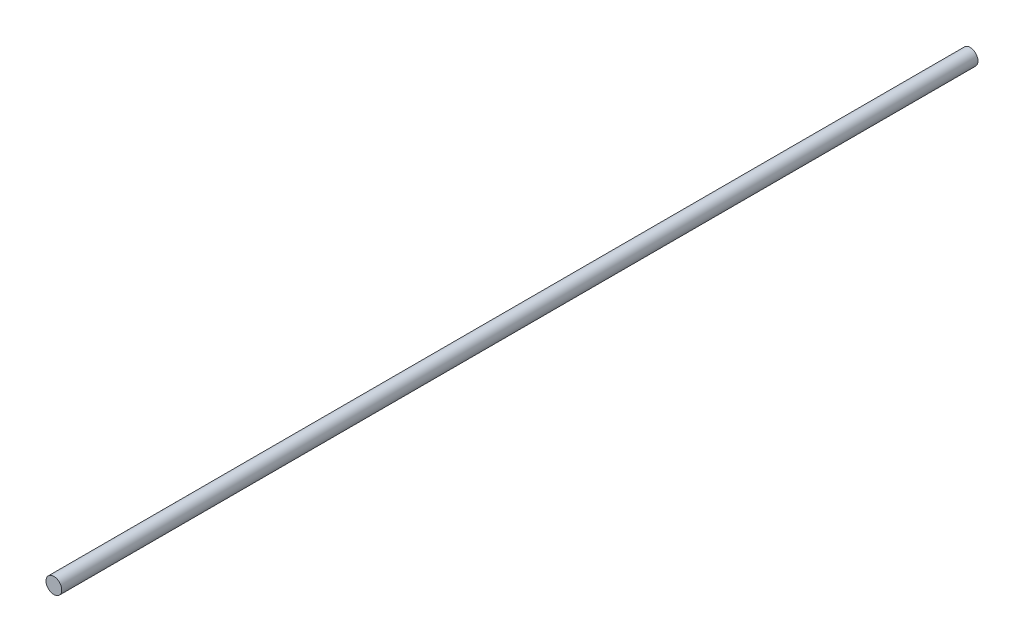
ISO-10303-21;
HEADER;
FILE_DESCRIPTION(('STEP AP214'),'2;1');
FILE_NAME('part.step','',(''),(''),'','','');
FILE_SCHEMA(('AUTOMOTIVE_DESIGN { 1 0 10303 214 1 1 1 1 }'));
ENDSEC;
DATA;
#1=APPLICATION_CONTEXT('core data for automotive mechanical design processes');
#2=APPLICATION_PROTOCOL_DEFINITION('international standard','automotive_design',2000,#1);
#3=PRODUCT_CONTEXT('',#1,'mechanical');
#4=PRODUCT('Part','Part','',(#3));
#5=PRODUCT_RELATED_PRODUCT_CATEGORY('part','',(#4));
#6=PRODUCT_DEFINITION_FORMATION('','',#4);
#7=PRODUCT_DEFINITION_CONTEXT('part definition',#1,'design');
#8=PRODUCT_DEFINITION('design','',#6,#7);
#9=PRODUCT_DEFINITION_SHAPE('','',#8);
#10=(LENGTH_UNIT() NAMED_UNIT(*) SI_UNIT(.MILLI.,.METRE.));
#11=(NAMED_UNIT(*) PLANE_ANGLE_UNIT() SI_UNIT($,.RADIAN.));
#12=(NAMED_UNIT(*) SI_UNIT($,.STERADIAN.) SOLID_ANGLE_UNIT());
#13=UNCERTAINTY_MEASURE_WITH_UNIT(LENGTH_MEASURE(1.E-05),#10,'distance_accuracy_value','');
#14=(GEOMETRIC_REPRESENTATION_CONTEXT(3) GLOBAL_UNCERTAINTY_ASSIGNED_CONTEXT((#13)) GLOBAL_UNIT_ASSIGNED_CONTEXT((#10,
#11,#12)) REPRESENTATION_CONTEXT('',''));
#15=CARTESIAN_POINT('',(0.,0.,0.));
#16=DIRECTION('',(0.,0.,1.));
#17=DIRECTION('',(1.,0.,0.));
#18=AXIS2_PLACEMENT_3D('',#15,#16,#17);
#19=CARTESIAN_POINT('',(0.,0.,368.809233063586));
#20=DIRECTION('',(0.,0.,-1.));
#21=DIRECTION('',(-1.,0.,0.));
#22=AXIS2_PLACEMENT_3D('',#19,#20,#21);
#23=CYLINDRICAL_SURFACE('',#22,3.175);
#24=CARTESIAN_POINT('',(0.,0.,368.809233063586));
#25=DIRECTION('',(0.,0.,1.));
#26=DIRECTION('',(1.,0.,0.));
#27=AXIS2_PLACEMENT_3D('',#24,#25,#26);
#28=CIRCLE('',#27,3.175);
#29=CARTESIAN_POINT('',(3.175,0.,368.809233063586));
#30=VERTEX_POINT('',#29);
#31=EDGE_CURVE('E10',#30,#30,#28,.T.);
#32=ORIENTED_EDGE('',*,*,#31,.F.);
#33=EDGE_LOOP('',(#32));
#34=FACE_BOUND('',#33,.T.);
#35=CARTESIAN_POINT('',(0.,0.,0.));
#36=DIRECTION('',(0.,0.,1.));
#37=DIRECTION('',(1.,0.,0.));
#38=AXIS2_PLACEMENT_3D('',#35,#36,#37);
#39=CIRCLE('',#38,3.175);
#40=CARTESIAN_POINT('',(3.175,0.,0.));
#41=VERTEX_POINT('',#40);
#42=EDGE_CURVE('E42',#41,#41,#39,.T.);
#43=ORIENTED_EDGE('',*,*,#42,.T.);
#44=EDGE_LOOP('',(#43));
#45=FACE_BOUND('',#44,.T.);
#46=ADVANCED_FACE('F41',(#34,#45),#23,.T.);
#47=CARTESIAN_POINT('',(0.,0.,368.809233063586));
#48=DIRECTION('',(0.,0.,1.));
#49=DIRECTION('',(1.,0.,0.));
#50=AXIS2_PLACEMENT_3D('',#47,#48,#49);
#51=PLANE('',#50);
#52=ORIENTED_EDGE('',*,*,#31,.T.);
#53=EDGE_LOOP('',(#52));
#54=FACE_BOUND('',#53,.T.);
#55=ADVANCED_FACE('F57',(#54),#51,.T.);
#56=CARTESIAN_POINT('',(0.,0.,0.));
#57=DIRECTION('',(0.,0.,1.));
#58=DIRECTION('',(1.,0.,0.));
#59=AXIS2_PLACEMENT_3D('',#56,#57,#58);
#60=PLANE('',#59);
#61=ORIENTED_EDGE('',*,*,#42,.F.);
#62=EDGE_LOOP('',(#61));
#63=FACE_BOUND('',#62,.T.);
#64=ADVANCED_FACE('F53',(#63),#60,.F.);
#65=CLOSED_SHELL('',(#46,#55,#64));
#66=MANIFOLD_SOLID_BREP('B2',#65);
#67=ADVANCED_BREP_SHAPE_REPRESENTATION('',(#18,#66),#14);
#68=SHAPE_DEFINITION_REPRESENTATION(#9,#67);
ENDSEC;
END-ISO-10303-21;
